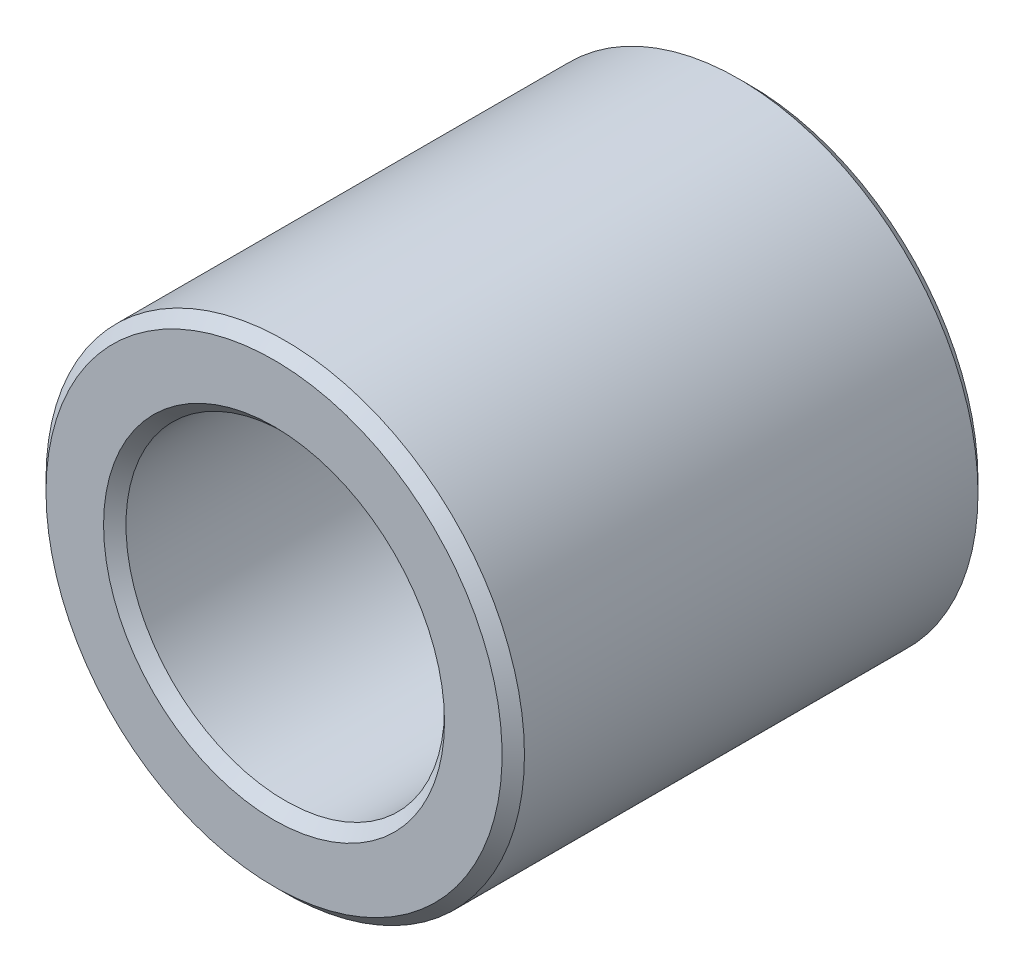
ISO-10303-21;
HEADER;
FILE_DESCRIPTION(('STEP AP214'),'2;1');
FILE_NAME('part.step','',(''),(''),'','','');
FILE_SCHEMA(('AUTOMOTIVE_DESIGN { 1 0 10303 214 1 1 1 1 }'));
ENDSEC;
DATA;
#1=APPLICATION_CONTEXT('core data for automotive mechanical design processes');
#2=APPLICATION_PROTOCOL_DEFINITION('international standard','automotive_design',2000,#1);
#3=PRODUCT_CONTEXT('',#1,'mechanical');
#4=PRODUCT('Part','Part','',(#3));
#5=PRODUCT_RELATED_PRODUCT_CATEGORY('part','',(#4));
#6=PRODUCT_DEFINITION_FORMATION('','',#4);
#7=PRODUCT_DEFINITION_CONTEXT('part definition',#1,'design');
#8=PRODUCT_DEFINITION('design','',#6,#7);
#9=PRODUCT_DEFINITION_SHAPE('','',#8);
#10=(LENGTH_UNIT() NAMED_UNIT(*) SI_UNIT(.MILLI.,.METRE.));
#11=(NAMED_UNIT(*) PLANE_ANGLE_UNIT() SI_UNIT($,.RADIAN.));
#12=(NAMED_UNIT(*) SI_UNIT($,.STERADIAN.) SOLID_ANGLE_UNIT());
#13=UNCERTAINTY_MEASURE_WITH_UNIT(LENGTH_MEASURE(1.E-05),#10,'distance_accuracy_value','');
#14=(GEOMETRIC_REPRESENTATION_CONTEXT(3) GLOBAL_UNCERTAINTY_ASSIGNED_CONTEXT((#13)) GLOBAL_UNIT_ASSIGNED_CONTEXT((#10,
#11,#12)) REPRESENTATION_CONTEXT('',''));
#15=CARTESIAN_POINT('',(0.,0.,0.));
#16=DIRECTION('',(0.,0.,1.));
#17=DIRECTION('',(1.,0.,0.));
#18=AXIS2_PLACEMENT_3D('',#15,#16,#17);
#19=CARTESIAN_POINT('',(0.,0.,-4.7625));
#20=DIRECTION('',(0.,0.,1.));
#21=DIRECTION('',(1.,0.,0.));
#22=AXIS2_PLACEMENT_3D('',#19,#20,#21);
#23=CYLINDRICAL_SURFACE('',#22,4.7879);
#24=CARTESIAN_POINT('',(0.,0.,-4.538472));
#25=DIRECTION('',(0.,0.,1.));
#26=DIRECTION('',(1.,0.,0.));
#27=AXIS2_PLACEMENT_3D('',#24,#25,#26);
#28=CIRCLE('',#27,4.7879);
#29=CARTESIAN_POINT('',(4.7879,0.,-4.538472));
#30=VERTEX_POINT('',#29);
#31=EDGE_CURVE('E76',#30,#30,#28,.T.);
#32=ORIENTED_EDGE('',*,*,#31,.T.);
#33=EDGE_LOOP('',(#32));
#34=FACE_BOUND('',#33,.T.);
#35=CARTESIAN_POINT('',(0.,0.,4.538472));
#36=DIRECTION('',(0.,0.,1.));
#37=DIRECTION('',(1.,0.,0.));
#38=AXIS2_PLACEMENT_3D('',#35,#36,#37);
#39=CIRCLE('',#38,4.7879);
#40=CARTESIAN_POINT('',(-4.7879,0.,4.538472));
#41=VERTEX_POINT('',#40);
#42=EDGE_CURVE('E82',#41,#41,#39,.F.);
#43=ORIENTED_EDGE('',*,*,#42,.T.);
#44=EDGE_LOOP('',(#43));
#45=FACE_BOUND('',#44,.T.);
#46=ADVANCED_FACE('F43',(#34,#45),#23,.T.);
#47=CARTESIAN_POINT('',(0.,0.,-4.7625));
#48=DIRECTION('',(0.,0.,1.));
#49=DIRECTION('',(1.,0.,0.));
#50=AXIS2_PLACEMENT_3D('',#47,#48,#49);
#51=PLANE('',#50);
#52=CARTESIAN_POINT('',(0.,0.,-4.7625));
#53=DIRECTION('',(0.,0.,1.));
#54=DIRECTION('',(1.,0.,0.));
#55=AXIS2_PLACEMENT_3D('',#52,#53,#54);
#56=CIRCLE('',#55,4.563872);
#57=CARTESIAN_POINT('',(4.563872,0.,-4.7625));
#58=VERTEX_POINT('',#57);
#59=EDGE_CURVE('E67',#58,#58,#56,.F.);
#60=ORIENTED_EDGE('',*,*,#59,.T.);
#61=EDGE_LOOP('',(#60));
#62=FACE_BOUND('',#61,.T.);
#63=CARTESIAN_POINT('',(0.,0.,-4.7625));
#64=DIRECTION('',(0.,0.,1.));
#65=DIRECTION('',(1.,0.,0.));
#66=AXIS2_PLACEMENT_3D('',#63,#64,#65);
#67=CIRCLE('',#66,3.411728);
#68=CARTESIAN_POINT('',(3.411728,0.,-4.7625));
#69=VERTEX_POINT('',#68);
#70=EDGE_CURVE('E72',#69,#69,#67,.T.);
#71=ORIENTED_EDGE('',*,*,#70,.T.);
#72=EDGE_LOOP('',(#71));
#73=FACE_BOUND('',#72,.T.);
#74=ADVANCED_FACE('F96',(#62,#73),#51,.F.);
#75=CARTESIAN_POINT('',(0.,0.,-4.7625));
#76=DIRECTION('',(0.,0.,1.));
#77=DIRECTION('',(1.,0.,0.));
#78=AXIS2_PLACEMENT_3D('',#75,#76,#77);
#79=CYLINDRICAL_SURFACE('',#78,3.1877);
#80=CARTESIAN_POINT('',(0.,0.,-4.538472));
#81=DIRECTION('',(0.,0.,1.));
#82=DIRECTION('',(1.,0.,0.));
#83=AXIS2_PLACEMENT_3D('',#80,#81,#82);
#84=CIRCLE('',#83,3.1877);
#85=CARTESIAN_POINT('',(3.1877,0.,-4.538472));
#86=VERTEX_POINT('',#85);
#87=EDGE_CURVE('E59',#86,#86,#84,.F.);
#88=ORIENTED_EDGE('',*,*,#87,.T.);
#89=EDGE_LOOP('',(#88));
#90=FACE_BOUND('',#89,.T.);
#91=CARTESIAN_POINT('',(0.,0.,4.538472));
#92=DIRECTION('',(0.,0.,1.));
#93=DIRECTION('',(1.,0.,0.));
#94=AXIS2_PLACEMENT_3D('',#91,#92,#93);
#95=CIRCLE('',#94,3.1877);
#96=CARTESIAN_POINT('',(3.1877,0.,4.538472));
#97=VERTEX_POINT('',#96);
#98=EDGE_CURVE('E63',#97,#97,#95,.T.);
#99=ORIENTED_EDGE('',*,*,#98,.T.);
#100=EDGE_LOOP('',(#99));
#101=FACE_BOUND('',#100,.T.);
#102=ADVANCED_FACE('F104',(#90,#101),#79,.F.);
#103=CARTESIAN_POINT('',(0.,0.,4.7625));
#104=DIRECTION('',(0.,0.,1.));
#105=DIRECTION('',(1.,0.,0.));
#106=AXIS2_PLACEMENT_3D('',#103,#104,#105);
#107=PLANE('',#106);
#108=CARTESIAN_POINT('',(0.,0.,4.7625));
#109=DIRECTION('',(0.,0.,1.));
#110=DIRECTION('',(1.,0.,0.));
#111=AXIS2_PLACEMENT_3D('',#108,#109,#110);
#112=CIRCLE('',#111,3.411728);
#113=CARTESIAN_POINT('',(3.411728,0.,4.7625));
#114=VERTEX_POINT('',#113);
#115=EDGE_CURVE('E10',#114,#114,#112,.F.);
#116=ORIENTED_EDGE('',*,*,#115,.T.);
#117=EDGE_LOOP('',(#116));
#118=FACE_BOUND('',#117,.T.);
#119=CARTESIAN_POINT('',(0.,0.,4.7625));
#120=DIRECTION('',(0.,0.,1.));
#121=DIRECTION('',(1.,0.,0.));
#122=AXIS2_PLACEMENT_3D('',#119,#120,#121);
#123=CIRCLE('',#122,4.563872);
#124=CARTESIAN_POINT('',(-4.563872,0.,4.7625));
#125=VERTEX_POINT('',#124);
#126=EDGE_CURVE('E55',#125,#125,#123,.T.);
#127=ORIENTED_EDGE('',*,*,#126,.T.);
#128=EDGE_LOOP('',(#127));
#129=FACE_BOUND('',#128,.T.);
#130=ADVANCED_FACE('F116',(#118,#129),#107,.T.);
#131=CARTESIAN_POINT('',(0.,0.,-4.538472));
#132=DIRECTION('',(0.,0.,1.));
#133=DIRECTION('',(1.,0.,0.));
#134=AXIS2_PLACEMENT_3D('',#131,#132,#133);
#135=CONICAL_SURFACE('',#134,4.7879,0.785398163397452);
#136=ORIENTED_EDGE('',*,*,#59,.F.);
#137=EDGE_LOOP('',(#136));
#138=FACE_BOUND('',#137,.T.);
#139=ORIENTED_EDGE('',*,*,#31,.F.);
#140=EDGE_LOOP('',(#139));
#141=FACE_BOUND('',#140,.T.);
#142=ADVANCED_FACE('F109',(#138,#141),#135,.T.);
#143=CARTESIAN_POINT('',(0.,0.,-4.7625));
#144=DIRECTION('',(0.,0.,-1.));
#145=DIRECTION('',(-1.,0.,0.));
#146=AXIS2_PLACEMENT_3D('',#143,#144,#145);
#147=CONICAL_SURFACE('',#146,3.411728,0.78539816339745);
#148=ORIENTED_EDGE('',*,*,#87,.F.);
#149=EDGE_LOOP('',(#148));
#150=FACE_BOUND('',#149,.T.);
#151=ORIENTED_EDGE('',*,*,#70,.F.);
#152=EDGE_LOOP('',(#151));
#153=FACE_BOUND('',#152,.T.);
#154=ADVANCED_FACE('F94',(#150,#153),#147,.F.);
#155=CARTESIAN_POINT('',(0.,0.,4.538472));
#156=DIRECTION('',(0.,0.,1.));
#157=DIRECTION('',(1.,0.,0.));
#158=AXIS2_PLACEMENT_3D('',#155,#156,#157);
#159=CONICAL_SURFACE('',#158,3.1877,0.78539816339745);
#160=CARTESIAN_POINT('',(3.411728,0.,4.7625));
#161=CARTESIAN_POINT('',(3.409394375,0.,4.760166375));
#162=CARTESIAN_POINT('',(3.40706075,0.,4.75783275));
#163=CARTESIAN_POINT('',(3.4023935,0.,4.7531655));
#164=CARTESIAN_POINT('',(3.400059875,0.,4.750831875));
#165=CARTESIAN_POINT('',(3.395392625,0.,4.746164625));
#166=CARTESIAN_POINT('',(3.393059,0.,4.743831));
#167=CARTESIAN_POINT('',(3.38839175,0.,4.73916375));
#168=CARTESIAN_POINT('',(3.386058125,0.,4.736830125));
#169=CARTESIAN_POINT('',(3.381390875,0.,4.732162875));
#170=CARTESIAN_POINT('',(3.37905725,0.,4.72982925));
#171=CARTESIAN_POINT('',(3.37439,0.,4.725162));
#172=CARTESIAN_POINT('',(3.372056375,0.,4.722828375));
#173=CARTESIAN_POINT('',(3.367389125,0.,4.718161125));
#174=CARTESIAN_POINT('',(3.3650555,0.,4.7158275));
#175=CARTESIAN_POINT('',(3.36038825,0.,4.71116025));
#176=CARTESIAN_POINT('',(3.358054625,0.,4.708826625));
#177=CARTESIAN_POINT('',(3.353387375,0.,4.704159375));
#178=CARTESIAN_POINT('',(3.35105375,0.,4.70182575));
#179=CARTESIAN_POINT('',(3.3463865,0.,4.6971585));
#180=CARTESIAN_POINT('',(3.344052875,0.,4.694824875));
#181=CARTESIAN_POINT('',(3.339385625,0.,4.690157625));
#182=CARTESIAN_POINT('',(3.337052,0.,4.687824));
#183=CARTESIAN_POINT('',(3.33238475,0.,4.68315675));
#184=CARTESIAN_POINT('',(3.330051125,0.,4.680823125));
#185=CARTESIAN_POINT('',(3.325383875,0.,4.676155875));
#186=CARTESIAN_POINT('',(3.32305025,0.,4.67382225));
#187=CARTESIAN_POINT('',(3.318383,0.,4.669155));
#188=CARTESIAN_POINT('',(3.316049375,0.,4.666821375));
#189=CARTESIAN_POINT('',(3.311382125,0.,4.662154125));
#190=CARTESIAN_POINT('',(3.3090485,0.,4.6598205));
#191=CARTESIAN_POINT('',(3.30438125,0.,4.65515325));
#192=CARTESIAN_POINT('',(3.302047625,0.,4.652819625));
#193=CARTESIAN_POINT('',(3.297380375,0.,4.648152375));
#194=CARTESIAN_POINT('',(3.29504675,0.,4.64581875));
#195=CARTESIAN_POINT('',(3.2903795,0.,4.6411515));
#196=CARTESIAN_POINT('',(3.288045875,0.,4.638817875));
#197=CARTESIAN_POINT('',(3.283378625,0.,4.634150625));
#198=CARTESIAN_POINT('',(3.281045,0.,4.631817));
#199=CARTESIAN_POINT('',(3.27637775,0.,4.62714975));
#200=CARTESIAN_POINT('',(3.274044125,0.,4.624816125));
#201=CARTESIAN_POINT('',(3.269376875,0.,4.620148875));
#202=CARTESIAN_POINT('',(3.26704325,0.,4.61781525));
#203=CARTESIAN_POINT('',(3.262376,0.,4.613148));
#204=CARTESIAN_POINT('',(3.260042375,0.,4.610814375));
#205=CARTESIAN_POINT('',(3.255375125,0.,4.606147125));
#206=CARTESIAN_POINT('',(3.2530415,0.,4.6038135));
#207=CARTESIAN_POINT('',(3.24837425,0.,4.59914625));
#208=CARTESIAN_POINT('',(3.246040625,0.,4.596812625));
#209=CARTESIAN_POINT('',(3.241373375,0.,4.592145375));
#210=CARTESIAN_POINT('',(3.23903975,0.,4.58981175));
#211=CARTESIAN_POINT('',(3.2343725,0.,4.5851445));
#212=CARTESIAN_POINT('',(3.232038875,0.,4.582810875));
#213=CARTESIAN_POINT('',(3.227371625,0.,4.578143625));
#214=CARTESIAN_POINT('',(3.225038,0.,4.57581));
#215=CARTESIAN_POINT('',(3.22037075,0.,4.57114275));
#216=CARTESIAN_POINT('',(3.218037125,0.,4.568809125));
#217=CARTESIAN_POINT('',(3.213369875,0.,4.564141875));
#218=CARTESIAN_POINT('',(3.21103625,0.,4.56180825));
#219=CARTESIAN_POINT('',(3.206369,0.,4.557141));
#220=CARTESIAN_POINT('',(3.204035375,0.,4.554807375));
#221=CARTESIAN_POINT('',(3.199368125,0.,4.550140125));
#222=CARTESIAN_POINT('',(3.1970345,0.,4.5478065));
#223=CARTESIAN_POINT('',(3.19236725,0.,4.54313925));
#224=CARTESIAN_POINT('',(3.190033625,0.,4.540805625));
#225=CARTESIAN_POINT('',(3.1877,0.,4.538472));
#226=B_SPLINE_CURVE_WITH_KNOTS('',3,(#160,#161,#162,#163,#164,#165,#166,#167,#168,#169,#170,
#171,#172,#173,#174,#175,#176,#177,#178,#179,#180,#181,#182,#183,#184,#185,#186,#187,#188,#189,
#190,#191,#192,#193,#194,#195,#196,#197,#198,#199,#200,#201,#202,#203,#204,#205,#206,#207,#208,
#209,#210,#211,#212,#213,#214,#215,#216,#217,#218,#219,#220,#221,#222,#223,#224,#225),
.UNSPECIFIED.,.F.,.F.,(4,2,2,2,2,2,2,2,2,2,2,2,2,2,2,2,2,2,2,2,2,2,2,2,2,2,2,2,2,2,2,2,4),(0.,
0.00990073237347848,0.0198014647469576,0.0297021971204364,0.0396029294939155,0.049503661867394,
0.059404394240873,0.0693051266143515,0.0792058589878306,0.08910659136131,0.0990073237347885,
0.108908056108268,0.118808788481746,0.128709520855225,0.138610253228704,0.148510985602183,
0.158411717975662,0.168312450349141,0.17821318272262,0.188113915096099,0.198014647469578,
0.207915379843056,0.217816112216535,0.227716844590014,0.237617576963493,0.247518309336972,
0.257419041710451,0.26731977408393,0.277220506457408,0.287121238830887,0.297021971204366,
0.306922703577845,0.316823435951324),.UNSPECIFIED.);
#227=EDGE_CURVE('BSEAM93',#114,#97,#226,.T.);
#228=ORIENTED_EDGE('',*,*,#115,.F.);
#229=ORIENTED_EDGE('',*,*,#98,.F.);
#230=ORIENTED_EDGE('',*,*,#227,.T.);
#231=ORIENTED_EDGE('',*,*,#227,.F.);
#232=EDGE_LOOP('',(#228,#230,#229,#231));
#233=FACE_BOUND('',#232,.T.);
#234=ADVANCED_FACE('F93',(#233),#159,.F.);
#235=CARTESIAN_POINT('',(0.,0.,4.7625));
#236=DIRECTION('',(0.,0.,-1.));
#237=DIRECTION('',(-1.,0.,0.));
#238=AXIS2_PLACEMENT_3D('',#235,#236,#237);
#239=CONICAL_SURFACE('',#238,4.563872,0.78539816339745);
#240=CARTESIAN_POINT('',(-4.7879,0.,4.538472));
#241=CARTESIAN_POINT('',(-4.785566375,0.,4.540805625));
#242=CARTESIAN_POINT('',(-4.78323275,0.,4.54313925));
#243=CARTESIAN_POINT('',(-4.7785655,0.,4.5478065));
#244=CARTESIAN_POINT('',(-4.776231875,0.,4.550140125));
#245=CARTESIAN_POINT('',(-4.771564625,0.,4.554807375));
#246=CARTESIAN_POINT('',(-4.769231,0.,4.557141));
#247=CARTESIAN_POINT('',(-4.76456375,0.,4.56180825));
#248=CARTESIAN_POINT('',(-4.762230125,0.,4.564141875));
#249=CARTESIAN_POINT('',(-4.757562875,0.,4.568809125));
#250=CARTESIAN_POINT('',(-4.75522925,0.,4.57114275));
#251=CARTESIAN_POINT('',(-4.750562,0.,4.57581));
#252=CARTESIAN_POINT('',(-4.748228375,0.,4.578143625));
#253=CARTESIAN_POINT('',(-4.743561125,0.,4.582810875));
#254=CARTESIAN_POINT('',(-4.7412275,0.,4.5851445));
#255=CARTESIAN_POINT('',(-4.73656025,0.,4.58981175));
#256=CARTESIAN_POINT('',(-4.734226625,0.,4.592145375));
#257=CARTESIAN_POINT('',(-4.729559375,0.,4.596812625));
#258=CARTESIAN_POINT('',(-4.72722575,0.,4.59914625));
#259=CARTESIAN_POINT('',(-4.7225585,0.,4.6038135));
#260=CARTESIAN_POINT('',(-4.720224875,0.,4.606147125));
#261=CARTESIAN_POINT('',(-4.715557625,0.,4.610814375));
#262=CARTESIAN_POINT('',(-4.713224,0.,4.613148));
#263=CARTESIAN_POINT('',(-4.70855675,0.,4.61781525));
#264=CARTESIAN_POINT('',(-4.706223125,0.,4.620148875));
#265=CARTESIAN_POINT('',(-4.701555875,0.,4.624816125));
#266=CARTESIAN_POINT('',(-4.69922225,0.,4.62714975));
#267=CARTESIAN_POINT('',(-4.694555,0.,4.631817));
#268=CARTESIAN_POINT('',(-4.692221375,0.,4.634150625));
#269=CARTESIAN_POINT('',(-4.687554125,0.,4.638817875));
#270=CARTESIAN_POINT('',(-4.6852205,0.,4.6411515));
#271=CARTESIAN_POINT('',(-4.68055325,0.,4.64581875));
#272=CARTESIAN_POINT('',(-4.678219625,0.,4.648152375));
#273=CARTESIAN_POINT('',(-4.673552375,0.,4.652819625));
#274=CARTESIAN_POINT('',(-4.67121875,0.,4.65515325));
#275=CARTESIAN_POINT('',(-4.6665515,0.,4.6598205));
#276=CARTESIAN_POINT('',(-4.664217875,0.,4.662154125));
#277=CARTESIAN_POINT('',(-4.659550625,0.,4.666821375));
#278=CARTESIAN_POINT('',(-4.657217,0.,4.669155));
#279=CARTESIAN_POINT('',(-4.65254975,0.,4.67382225));
#280=CARTESIAN_POINT('',(-4.650216125,0.,4.676155875));
#281=CARTESIAN_POINT('',(-4.645548875,0.,4.680823125));
#282=CARTESIAN_POINT('',(-4.64321525,0.,4.68315675));
#283=CARTESIAN_POINT('',(-4.638548,0.,4.687824));
#284=CARTESIAN_POINT('',(-4.636214375,0.,4.690157625));
#285=CARTESIAN_POINT('',(-4.631547125,0.,4.694824875));
#286=CARTESIAN_POINT('',(-4.6292135,0.,4.6971585));
#287=CARTESIAN_POINT('',(-4.62454625,0.,4.70182575));
#288=CARTESIAN_POINT('',(-4.622212625,0.,4.704159375));
#289=CARTESIAN_POINT('',(-4.617545375,0.,4.708826625));
#290=CARTESIAN_POINT('',(-4.61521175,0.,4.71116025));
#291=CARTESIAN_POINT('',(-4.6105445,0.,4.7158275));
#292=CARTESIAN_POINT('',(-4.608210875,0.,4.718161125));
#293=CARTESIAN_POINT('',(-4.603543625,0.,4.722828375));
#294=CARTESIAN_POINT('',(-4.60121,0.,4.725162));
#295=CARTESIAN_POINT('',(-4.59654275,0.,4.72982925));
#296=CARTESIAN_POINT('',(-4.594209125,0.,4.732162875));
#297=CARTESIAN_POINT('',(-4.589541875,0.,4.736830125));
#298=CARTESIAN_POINT('',(-4.58720825,0.,4.73916375));
#299=CARTESIAN_POINT('',(-4.582541,0.,4.743831));
#300=CARTESIAN_POINT('',(-4.580207375,0.,4.746164625));
#301=CARTESIAN_POINT('',(-4.575540125,0.,4.750831875));
#302=CARTESIAN_POINT('',(-4.5732065,0.,4.7531655));
#303=CARTESIAN_POINT('',(-4.56853925,0.,4.75783275));
#304=CARTESIAN_POINT('',(-4.566205625,0.,4.760166375));
#305=CARTESIAN_POINT('',(-4.563872,0.,4.7625));
#306=B_SPLINE_CURVE_WITH_KNOTS('',3,(#240,#241,#242,#243,#244,#245,#246,#247,#248,#249,#250,
#251,#252,#253,#254,#255,#256,#257,#258,#259,#260,#261,#262,#263,#264,#265,#266,#267,#268,#269,
#270,#271,#272,#273,#274,#275,#276,#277,#278,#279,#280,#281,#282,#283,#284,#285,#286,#287,#288,
#289,#290,#291,#292,#293,#294,#295,#296,#297,#298,#299,#300,#301,#302,#303,#304,#305),
.UNSPECIFIED.,.F.,.F.,(4,2,2,2,2,2,2,2,2,2,2,2,2,2,2,2,2,2,2,2,2,2,2,2,2,2,2,2,2,2,2,2,4),(0.,
0.0099007323734794,0.0198014647469588,0.029702197120437,0.0396029294939164,0.0495036618673946,
0.059404394240874,0.0693051266143528,0.0792058589878316,0.089106591361311,0.0990073237347891,
0.108908056108269,0.118808788481747,0.128709520855226,0.138610253228705,0.148510985602184,
0.158411717975662,0.168312450349142,0.178213182722621,0.188113915096099,0.198014647469578,
0.207915379843057,0.217816112216536,0.227716844590015,0.237617576963494,0.247518309336973,
0.257419041710452,0.267319774083931,0.277220506457409,0.287121238830889,0.297021971204367,
0.306922703577846,0.316823435951325),.UNSPECIFIED.);
#307=EDGE_CURVE('BSEAM46',#41,#125,#306,.T.);
#308=ORIENTED_EDGE('',*,*,#42,.F.);
#309=ORIENTED_EDGE('',*,*,#126,.F.);
#310=ORIENTED_EDGE('',*,*,#307,.T.);
#311=ORIENTED_EDGE('',*,*,#307,.F.);
#312=EDGE_LOOP('',(#308,#310,#309,#311));
#313=FACE_BOUND('',#312,.T.);
#314=ADVANCED_FACE('F46',(#313),#239,.T.);
#315=CLOSED_SHELL('',(#46,#74,#102,#130,#142,#154,#234,#314));
#316=MANIFOLD_SOLID_BREP('B2',#315);
#317=ADVANCED_BREP_SHAPE_REPRESENTATION('',(#18,#316),#14);
#318=SHAPE_DEFINITION_REPRESENTATION(#9,#317);
ENDSEC;
END-ISO-10303-21;
